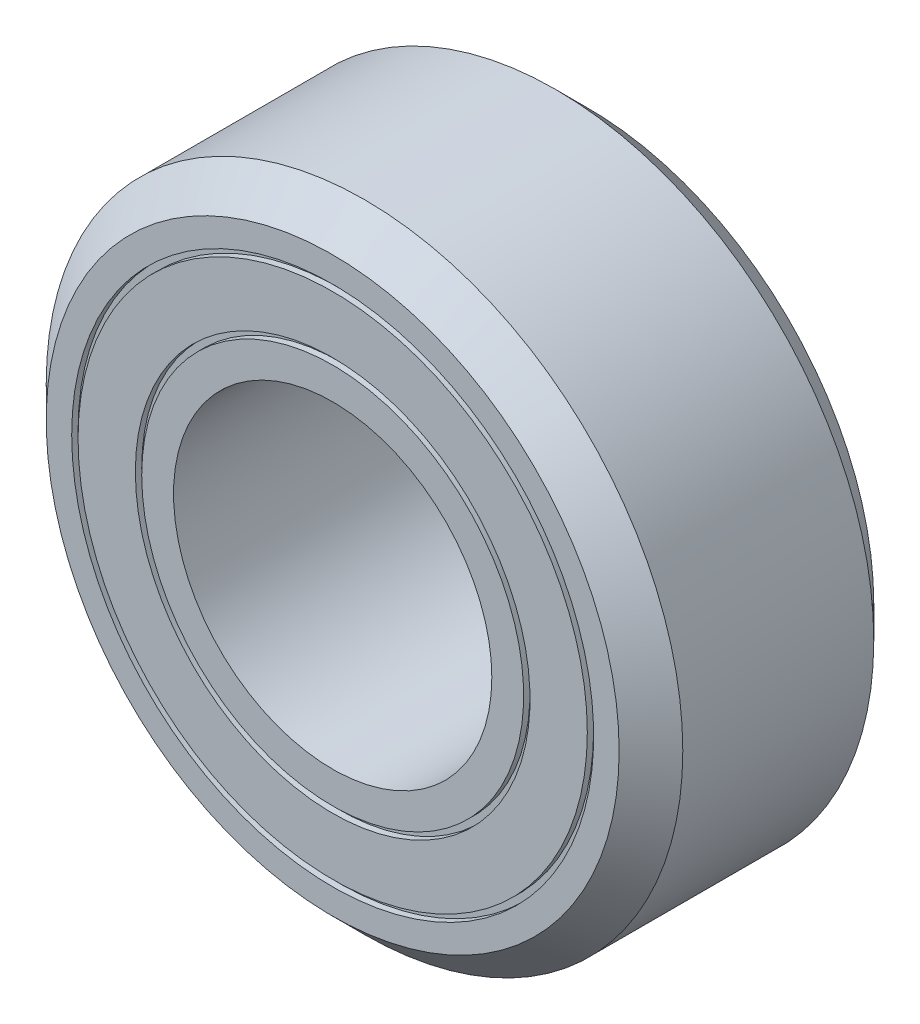
ISO-10303-21;
HEADER;
FILE_DESCRIPTION(('STEP AP214'),'2;1');
FILE_NAME('part.step','',(''),(''),'','','');
FILE_SCHEMA(('AUTOMOTIVE_DESIGN { 1 0 10303 214 1 1 1 1 }'));
ENDSEC;
DATA;
#1=APPLICATION_CONTEXT('core data for automotive mechanical design processes');
#2=APPLICATION_PROTOCOL_DEFINITION('international standard','automotive_design',2000,#1);
#3=PRODUCT_CONTEXT('',#1,'mechanical');
#4=PRODUCT('Part','Part','',(#3));
#5=PRODUCT_RELATED_PRODUCT_CATEGORY('part','',(#4));
#6=PRODUCT_DEFINITION_FORMATION('','',#4);
#7=PRODUCT_DEFINITION_CONTEXT('part definition',#1,'design');
#8=PRODUCT_DEFINITION('design','',#6,#7);
#9=PRODUCT_DEFINITION_SHAPE('','',#8);
#10=(LENGTH_UNIT() NAMED_UNIT(*) SI_UNIT(.MILLI.,.METRE.));
#11=(NAMED_UNIT(*) PLANE_ANGLE_UNIT() SI_UNIT($,.RADIAN.));
#12=(NAMED_UNIT(*) SI_UNIT($,.STERADIAN.) SOLID_ANGLE_UNIT());
#13=UNCERTAINTY_MEASURE_WITH_UNIT(LENGTH_MEASURE(1.E-05),#10,'distance_accuracy_value','');
#14=(GEOMETRIC_REPRESENTATION_CONTEXT(3) GLOBAL_UNCERTAINTY_ASSIGNED_CONTEXT((#13)) GLOBAL_UNIT_ASSIGNED_CONTEXT((#10,
#11,#12)) REPRESENTATION_CONTEXT('',''));
#15=CARTESIAN_POINT('',(0.,0.,0.));
#16=DIRECTION('',(0.,0.,1.));
#17=DIRECTION('',(1.,0.,0.));
#18=AXIS2_PLACEMENT_3D('',#15,#16,#17);
#19=CARTESIAN_POINT('',(0.,0.,4.));
#20=DIRECTION('',(0.,0.,1.));
#21=DIRECTION('',(1.,0.,0.));
#22=AXIS2_PLACEMENT_3D('',#19,#20,#21);
#23=PLANE('',#22);
#24=CARTESIAN_POINT('',(0.,0.,4.));
#25=DIRECTION('',(0.,0.,1.));
#26=DIRECTION('',(1.,0.,0.));
#27=AXIS2_PLACEMENT_3D('',#24,#25,#26);
#28=CIRCLE('',#27,2.5);
#29=CARTESIAN_POINT('',(2.5,0.,4.));
#30=VERTEX_POINT('',#29);
#31=EDGE_CURVE('E104',#30,#30,#28,.T.);
#32=ORIENTED_EDGE('',*,*,#31,.F.);
#33=EDGE_LOOP('',(#32));
#34=FACE_BOUND('',#33,.T.);
#35=CARTESIAN_POINT('',(0.,0.,4.));
#36=DIRECTION('',(0.,0.,-1.));
#37=DIRECTION('',(-1.,0.,0.));
#38=AXIS2_PLACEMENT_3D('',#35,#36,#37);
#39=CIRCLE('',#38,3.);
#40=CARTESIAN_POINT('',(-3.,0.,4.));
#41=VERTEX_POINT('',#40);
#42=EDGE_CURVE('E169',#41,#41,#39,.T.);
#43=ORIENTED_EDGE('',*,*,#42,.F.);
#44=EDGE_LOOP('',(#43));
#45=FACE_BOUND('',#44,.T.);
#46=ADVANCED_FACE('F79',(#34,#45),#23,.T.);
#47=CARTESIAN_POINT('',(0.,0.,0.));
#48=DIRECTION('',(0.,0.,1.));
#49=DIRECTION('',(1.,0.,0.));
#50=AXIS2_PLACEMENT_3D('',#47,#48,#49);
#51=PLANE('',#50);
#52=CARTESIAN_POINT('',(0.,0.,0.));
#53=DIRECTION('',(0.,0.,1.));
#54=DIRECTION('',(1.,0.,0.));
#55=AXIS2_PLACEMENT_3D('',#52,#53,#54);
#56=CIRCLE('',#55,2.5);
#57=CARTESIAN_POINT('',(2.5,0.,0.));
#58=VERTEX_POINT('',#57);
#59=EDGE_CURVE('E105',#58,#58,#56,.T.);
#60=ORIENTED_EDGE('',*,*,#59,.T.);
#61=EDGE_LOOP('',(#60));
#62=FACE_BOUND('',#61,.T.);
#63=CARTESIAN_POINT('',(0.,0.,0.));
#64=DIRECTION('',(0.,0.,-1.));
#65=DIRECTION('',(-1.,0.,0.));
#66=AXIS2_PLACEMENT_3D('',#63,#64,#65);
#67=CIRCLE('',#66,3.);
#68=CARTESIAN_POINT('',(-3.,0.,0.));
#69=VERTEX_POINT('',#68);
#70=EDGE_CURVE('E122',#69,#69,#67,.T.);
#71=ORIENTED_EDGE('',*,*,#70,.T.);
#72=EDGE_LOOP('',(#71));
#73=FACE_BOUND('',#72,.T.);
#74=ADVANCED_FACE('F187',(#62,#73),#51,.F.);
#75=CARTESIAN_POINT('',(0.,0.,4.));
#76=DIRECTION('',(0.,0.,-1.));
#77=DIRECTION('',(-1.,0.,0.));
#78=AXIS2_PLACEMENT_3D('',#75,#76,#77);
#79=CIRCLE('',#78,4.1);
#80=CARTESIAN_POINT('',(-4.1,0.,4.));
#81=VERTEX_POINT('',#80);
#82=EDGE_CURVE('E145',#81,#81,#79,.T.);
#83=ORIENTED_EDGE('',*,*,#82,.T.);
#84=EDGE_LOOP('',(#83));
#85=FACE_BOUND('',#84,.T.);
#86=CARTESIAN_POINT('',(0.,0.,4.));
#87=DIRECTION('',(0.,0.,1.));
#88=DIRECTION('',(1.,0.,0.));
#89=AXIS2_PLACEMENT_3D('',#86,#87,#88);
#90=CIRCLE('',#89,4.5);
#91=CARTESIAN_POINT('',(4.5,0.,4.));
#92=VERTEX_POINT('',#91);
#93=EDGE_CURVE('E11',#92,#92,#90,.T.);
#94=ORIENTED_EDGE('',*,*,#93,.T.);
#95=EDGE_LOOP('',(#94));
#96=FACE_BOUND('',#95,.T.);
#97=ADVANCED_FACE('F191',(#85,#96),#23,.T.);
#98=CARTESIAN_POINT('',(0.,0.,0.));
#99=DIRECTION('',(0.,0.,-1.));
#100=DIRECTION('',(-1.,0.,0.));
#101=AXIS2_PLACEMENT_3D('',#98,#99,#100);
#102=CIRCLE('',#101,4.1);
#103=CARTESIAN_POINT('',(-4.1,0.,0.));
#104=VERTEX_POINT('',#103);
#105=EDGE_CURVE('E113',#104,#104,#102,.T.);
#106=ORIENTED_EDGE('',*,*,#105,.F.);
#107=EDGE_LOOP('',(#106));
#108=FACE_BOUND('',#107,.T.);
#109=CARTESIAN_POINT('',(0.,0.,0.));
#110=DIRECTION('',(0.,0.,1.));
#111=DIRECTION('',(1.,0.,0.));
#112=AXIS2_PLACEMENT_3D('',#109,#110,#111);
#113=CIRCLE('',#112,4.49999999999999);
#114=CARTESIAN_POINT('',(4.49999999999999,0.,0.));
#115=VERTEX_POINT('',#114);
#116=EDGE_CURVE('E88',#115,#115,#113,.F.);
#117=ORIENTED_EDGE('',*,*,#116,.T.);
#118=EDGE_LOOP('',(#117));
#119=FACE_BOUND('',#118,.T.);
#120=ADVANCED_FACE('F198',(#108,#119),#51,.F.);
#121=CARTESIAN_POINT('',(0.,0.,4.));
#122=DIRECTION('',(0.,0.,-1.));
#123=DIRECTION('',(-1.,0.,0.));
#124=AXIS2_PLACEMENT_3D('',#121,#122,#123);
#125=CYLINDRICAL_SURFACE('',#124,5.);
#126=CARTESIAN_POINT('',(0.,0.,0.500000000000005));
#127=DIRECTION('',(0.,0.,1.));
#128=DIRECTION('',(1.,0.,0.));
#129=AXIS2_PLACEMENT_3D('',#126,#127,#128);
#130=CIRCLE('',#129,5.);
#131=CARTESIAN_POINT('',(5.,0.,0.500000000000005));
#132=VERTEX_POINT('',#131);
#133=EDGE_CURVE('E93',#132,#132,#130,.T.);
#134=ORIENTED_EDGE('',*,*,#133,.T.);
#135=EDGE_LOOP('',(#134));
#136=FACE_BOUND('',#135,.T.);
#137=CARTESIAN_POINT('',(0.,0.,3.5));
#138=DIRECTION('',(0.,0.,1.));
#139=DIRECTION('',(1.,0.,0.));
#140=AXIS2_PLACEMENT_3D('',#137,#138,#139);
#141=CIRCLE('',#140,5.);
#142=CARTESIAN_POINT('',(5.,0.,3.5));
#143=VERTEX_POINT('',#142);
#144=EDGE_CURVE('E98',#143,#143,#141,.F.);
#145=ORIENTED_EDGE('',*,*,#144,.T.);
#146=EDGE_LOOP('',(#145));
#147=FACE_BOUND('',#146,.T.);
#148=ADVANCED_FACE('F209',(#136,#147),#125,.T.);
#149=CARTESIAN_POINT('',(0.,0.,4.));
#150=DIRECTION('',(0.,0.,-1.));
#151=DIRECTION('',(-1.,0.,0.));
#152=AXIS2_PLACEMENT_3D('',#149,#150,#151);
#153=CYLINDRICAL_SURFACE('',#152,2.5);
#154=ORIENTED_EDGE('',*,*,#31,.T.);
#155=EDGE_LOOP('',(#154));
#156=FACE_BOUND('',#155,.T.);
#157=ORIENTED_EDGE('',*,*,#59,.F.);
#158=EDGE_LOOP('',(#157));
#159=FACE_BOUND('',#158,.T.);
#160=ADVANCED_FACE('F251',(#156,#159),#153,.F.);
#161=CARTESIAN_POINT('',(0.,0.,0.500000000000005));
#162=DIRECTION('',(0.,0.,1.));
#163=DIRECTION('',(1.,0.,0.));
#164=AXIS2_PLACEMENT_3D('',#161,#162,#163);
#165=CONICAL_SURFACE('',#164,5.,0.785398163397449);
#166=ORIENTED_EDGE('',*,*,#116,.F.);
#167=EDGE_LOOP('',(#166));
#168=FACE_BOUND('',#167,.T.);
#169=ORIENTED_EDGE('',*,*,#133,.F.);
#170=EDGE_LOOP('',(#169));
#171=FACE_BOUND('',#170,.T.);
#172=ADVANCED_FACE('F253',(#168,#171),#165,.T.);
#173=CARTESIAN_POINT('',(0.,0.,4.));
#174=DIRECTION('',(0.,0.,-1.));
#175=DIRECTION('',(-1.,0.,0.));
#176=AXIS2_PLACEMENT_3D('',#173,#174,#175);
#177=CONICAL_SURFACE('',#176,4.5,0.785398163397447);
#178=ORIENTED_EDGE('',*,*,#144,.F.);
#179=EDGE_LOOP('',(#178));
#180=FACE_BOUND('',#179,.T.);
#181=ORIENTED_EDGE('',*,*,#93,.F.);
#182=EDGE_LOOP('',(#181));
#183=FACE_BOUND('',#182,.T.);
#184=ADVANCED_FACE('F82',(#180,#183),#177,.T.);
#185=CARTESIAN_POINT('',(0.,0.,0.1));
#186=DIRECTION('',(0.,0.,-1.));
#187=DIRECTION('',(-1.,0.,0.));
#188=AXIS2_PLACEMENT_3D('',#185,#186,#187);
#189=CYLINDRICAL_SURFACE('',#188,4.);
#190=CARTESIAN_POINT('',(0.,0.,0.1));
#191=DIRECTION('',(0.,0.,-1.));
#192=DIRECTION('',(-1.,0.,0.));
#193=AXIS2_PLACEMENT_3D('',#190,#191,#192);
#194=CIRCLE('',#193,4.);
#195=CARTESIAN_POINT('',(-4.,0.,0.1));
#196=VERTEX_POINT('',#195);
#197=EDGE_CURVE('E117',#196,#196,#194,.T.);
#198=ORIENTED_EDGE('',*,*,#197,.T.);
#199=EDGE_LOOP('',(#198));
#200=FACE_BOUND('',#199,.T.);
#201=CARTESIAN_POINT('',(0.,0.,0.));
#202=DIRECTION('',(0.,0.,-1.));
#203=DIRECTION('',(-1.,0.,0.));
#204=AXIS2_PLACEMENT_3D('',#201,#202,#203);
#205=CIRCLE('',#204,4.);
#206=CARTESIAN_POINT('',(-4.,0.,0.));
#207=VERTEX_POINT('',#206);
#208=EDGE_CURVE('E118',#207,#207,#205,.T.);
#209=ORIENTED_EDGE('',*,*,#208,.F.);
#210=EDGE_LOOP('',(#209));
#211=FACE_BOUND('',#210,.T.);
#212=ADVANCED_FACE('F247',(#200,#211),#189,.T.);
#213=CARTESIAN_POINT('',(0.,0.,0.1));
#214=DIRECTION('',(0.,0.,-1.));
#215=DIRECTION('',(-1.,0.,0.));
#216=AXIS2_PLACEMENT_3D('',#213,#214,#215);
#217=CYLINDRICAL_SURFACE('',#216,4.1);
#218=CARTESIAN_POINT('',(0.,0.,0.1));
#219=DIRECTION('',(0.,0.,-1.));
#220=DIRECTION('',(-1.,0.,0.));
#221=AXIS2_PLACEMENT_3D('',#218,#219,#220);
#222=CIRCLE('',#221,4.1);
#223=CARTESIAN_POINT('',(-4.1,0.,0.1));
#224=VERTEX_POINT('',#223);
#225=EDGE_CURVE('E109',#224,#224,#222,.T.);
#226=ORIENTED_EDGE('',*,*,#225,.F.);
#227=EDGE_LOOP('',(#226));
#228=FACE_BOUND('',#227,.T.);
#229=ORIENTED_EDGE('',*,*,#105,.T.);
#230=EDGE_LOOP('',(#229));
#231=FACE_BOUND('',#230,.T.);
#232=ADVANCED_FACE('F243',(#228,#231),#217,.F.);
#233=CARTESIAN_POINT('',(0.,0.,0.1));
#234=DIRECTION('',(0.,0.,-1.));
#235=DIRECTION('',(-1.,0.,0.));
#236=AXIS2_PLACEMENT_3D('',#233,#234,#235);
#237=PLANE('',#236);
#238=ORIENTED_EDGE('',*,*,#197,.F.);
#239=EDGE_LOOP('',(#238));
#240=FACE_BOUND('',#239,.T.);
#241=ORIENTED_EDGE('',*,*,#225,.T.);
#242=EDGE_LOOP('',(#241));
#243=FACE_BOUND('',#242,.T.);
#244=ADVANCED_FACE('F240',(#240,#243),#237,.T.);
#245=CARTESIAN_POINT('',(0.,0.,0.));
#246=DIRECTION('',(0.,0.,-1.));
#247=DIRECTION('',(-1.,0.,0.));
#248=AXIS2_PLACEMENT_3D('',#245,#246,#247);
#249=CIRCLE('',#248,3.1);
#250=CARTESIAN_POINT('',(-3.1,0.,0.));
#251=VERTEX_POINT('',#250);
#252=EDGE_CURVE('E133',#251,#251,#249,.T.);
#253=ORIENTED_EDGE('',*,*,#252,.F.);
#254=EDGE_LOOP('',(#253));
#255=FACE_BOUND('',#254,.T.);
#256=ORIENTED_EDGE('',*,*,#208,.T.);
#257=EDGE_LOOP('',(#256));
#258=FACE_BOUND('',#257,.T.);
#259=ADVANCED_FACE('F197',(#255,#258),#51,.F.);
#260=CARTESIAN_POINT('',(0.,0.,0.1));
#261=DIRECTION('',(0.,0.,-1.));
#262=DIRECTION('',(-1.,0.,0.));
#263=AXIS2_PLACEMENT_3D('',#260,#261,#262);
#264=CYLINDRICAL_SURFACE('',#263,3.1);
#265=CARTESIAN_POINT('',(0.,0.,0.1));
#266=DIRECTION('',(0.,0.,-1.));
#267=DIRECTION('',(-1.,0.,0.));
#268=AXIS2_PLACEMENT_3D('',#265,#266,#267);
#269=CIRCLE('',#268,3.1);
#270=CARTESIAN_POINT('',(-3.1,0.,0.1));
#271=VERTEX_POINT('',#270);
#272=EDGE_CURVE('E137',#271,#271,#269,.T.);
#273=ORIENTED_EDGE('',*,*,#272,.F.);
#274=EDGE_LOOP('',(#273));
#275=FACE_BOUND('',#274,.T.);
#276=ORIENTED_EDGE('',*,*,#252,.T.);
#277=EDGE_LOOP('',(#276));
#278=FACE_BOUND('',#277,.T.);
#279=ADVANCED_FACE('F229',(#275,#278),#264,.F.);
#280=CARTESIAN_POINT('',(0.,0.,0.1));
#281=DIRECTION('',(0.,0.,-1.));
#282=DIRECTION('',(-1.,0.,0.));
#283=AXIS2_PLACEMENT_3D('',#280,#281,#282);
#284=PLANE('',#283);
#285=CARTESIAN_POINT('',(0.,0.,0.1));
#286=DIRECTION('',(0.,0.,-1.));
#287=DIRECTION('',(-1.,0.,0.));
#288=AXIS2_PLACEMENT_3D('',#285,#286,#287);
#289=CIRCLE('',#288,3.);
#290=CARTESIAN_POINT('',(-3.,0.,0.1));
#291=VERTEX_POINT('',#290);
#292=EDGE_CURVE('E129',#291,#291,#289,.T.);
#293=ORIENTED_EDGE('',*,*,#292,.F.);
#294=EDGE_LOOP('',(#293));
#295=FACE_BOUND('',#294,.T.);
#296=ORIENTED_EDGE('',*,*,#272,.T.);
#297=EDGE_LOOP('',(#296));
#298=FACE_BOUND('',#297,.T.);
#299=ADVANCED_FACE('F232',(#295,#298),#284,.T.);
#300=CARTESIAN_POINT('',(0.,0.,0.1));
#301=DIRECTION('',(0.,0.,-1.));
#302=DIRECTION('',(-1.,0.,0.));
#303=AXIS2_PLACEMENT_3D('',#300,#301,#302);
#304=CYLINDRICAL_SURFACE('',#303,3.);
#305=ORIENTED_EDGE('',*,*,#292,.T.);
#306=EDGE_LOOP('',(#305));
#307=FACE_BOUND('',#306,.T.);
#308=ORIENTED_EDGE('',*,*,#70,.F.);
#309=EDGE_LOOP('',(#308));
#310=FACE_BOUND('',#309,.T.);
#311=ADVANCED_FACE('F224',(#307,#310),#304,.T.);
#312=CARTESIAN_POINT('',(0.,0.,3.9));
#313=DIRECTION('',(0.,0.,1.));
#314=DIRECTION('',(1.,0.,0.));
#315=AXIS2_PLACEMENT_3D('',#312,#313,#314);
#316=CYLINDRICAL_SURFACE('',#315,4.);
#317=CARTESIAN_POINT('',(0.,0.,3.9));
#318=DIRECTION('',(0.,0.,-1.));
#319=DIRECTION('',(-1.,0.,0.));
#320=AXIS2_PLACEMENT_3D('',#317,#318,#319);
#321=CIRCLE('',#320,4.);
#322=CARTESIAN_POINT('',(-4.,0.,3.9));
#323=VERTEX_POINT('',#322);
#324=EDGE_CURVE('E149',#323,#323,#321,.T.);
#325=ORIENTED_EDGE('',*,*,#324,.F.);
#326=EDGE_LOOP('',(#325));
#327=FACE_BOUND('',#326,.T.);
#328=CARTESIAN_POINT('',(0.,0.,4.));
#329=DIRECTION('',(0.,0.,-1.));
#330=DIRECTION('',(-1.,0.,0.));
#331=AXIS2_PLACEMENT_3D('',#328,#329,#330);
#332=CIRCLE('',#331,4.);
#333=CARTESIAN_POINT('',(-4.,0.,4.));
#334=VERTEX_POINT('',#333);
#335=EDGE_CURVE('E150',#334,#334,#332,.T.);
#336=ORIENTED_EDGE('',*,*,#335,.T.);
#337=EDGE_LOOP('',(#336));
#338=FACE_BOUND('',#337,.T.);
#339=ADVANCED_FACE('F215',(#327,#338),#316,.T.);
#340=CARTESIAN_POINT('',(0.,0.,3.9));
#341=DIRECTION('',(0.,0.,1.));
#342=DIRECTION('',(1.,0.,0.));
#343=AXIS2_PLACEMENT_3D('',#340,#341,#342);
#344=CYLINDRICAL_SURFACE('',#343,4.1);
#345=CARTESIAN_POINT('',(0.,0.,3.9));
#346=DIRECTION('',(0.,0.,-1.));
#347=DIRECTION('',(-1.,0.,0.));
#348=AXIS2_PLACEMENT_3D('',#345,#346,#347);
#349=CIRCLE('',#348,4.1);
#350=CARTESIAN_POINT('',(-4.1,0.,3.9));
#351=VERTEX_POINT('',#350);
#352=EDGE_CURVE('E141',#351,#351,#349,.T.);
#353=ORIENTED_EDGE('',*,*,#352,.T.);
#354=EDGE_LOOP('',(#353));
#355=FACE_BOUND('',#354,.T.);
#356=ORIENTED_EDGE('',*,*,#82,.F.);
#357=EDGE_LOOP('',(#356));
#358=FACE_BOUND('',#357,.T.);
#359=ADVANCED_FACE('F213',(#355,#358),#344,.F.);
#360=CARTESIAN_POINT('',(0.,0.,3.9));
#361=DIRECTION('',(0.,0.,1.));
#362=DIRECTION('',(-1.,0.,0.));
#363=AXIS2_PLACEMENT_3D('',#360,#361,#362);
#364=PLANE('',#363);
#365=ORIENTED_EDGE('',*,*,#324,.T.);
#366=EDGE_LOOP('',(#365));
#367=FACE_BOUND('',#366,.T.);
#368=ORIENTED_EDGE('',*,*,#352,.F.);
#369=EDGE_LOOP('',(#368));
#370=FACE_BOUND('',#369,.T.);
#371=ADVANCED_FACE('F202',(#367,#370),#364,.T.);
#372=CARTESIAN_POINT('',(0.,0.,4.));
#373=DIRECTION('',(0.,0.,-1.));
#374=DIRECTION('',(-1.,0.,0.));
#375=AXIS2_PLACEMENT_3D('',#372,#373,#374);
#376=CIRCLE('',#375,3.1);
#377=CARTESIAN_POINT('',(-3.1,0.,4.));
#378=VERTEX_POINT('',#377);
#379=EDGE_CURVE('E161',#378,#378,#376,.T.);
#380=ORIENTED_EDGE('',*,*,#379,.T.);
#381=EDGE_LOOP('',(#380));
#382=FACE_BOUND('',#381,.T.);
#383=ORIENTED_EDGE('',*,*,#335,.F.);
#384=EDGE_LOOP('',(#383));
#385=FACE_BOUND('',#384,.T.);
#386=ADVANCED_FACE('F190',(#382,#385),#23,.T.);
#387=CARTESIAN_POINT('',(0.,0.,3.9));
#388=DIRECTION('',(0.,0.,1.));
#389=DIRECTION('',(-1.,0.,0.));
#390=AXIS2_PLACEMENT_3D('',#387,#388,#389);
#391=PLANE('',#390);
#392=CARTESIAN_POINT('',(0.,0.,3.9));
#393=DIRECTION('',(0.,0.,-1.));
#394=DIRECTION('',(-1.,0.,0.));
#395=AXIS2_PLACEMENT_3D('',#392,#393,#394);
#396=CIRCLE('',#395,3.1);
#397=CARTESIAN_POINT('',(-3.1,0.,3.9));
#398=VERTEX_POINT('',#397);
#399=EDGE_CURVE('E154',#398,#398,#396,.T.);
#400=ORIENTED_EDGE('',*,*,#399,.F.);
#401=EDGE_LOOP('',(#400));
#402=FACE_BOUND('',#401,.T.);
#403=CARTESIAN_POINT('',(0.,0.,3.9));
#404=DIRECTION('',(0.,0.,-1.));
#405=DIRECTION('',(-1.,0.,0.));
#406=AXIS2_PLACEMENT_3D('',#403,#404,#405);
#407=CIRCLE('',#406,3.);
#408=CARTESIAN_POINT('',(-3.,0.,3.9));
#409=VERTEX_POINT('',#408);
#410=EDGE_CURVE('E165',#409,#409,#407,.T.);
#411=ORIENTED_EDGE('',*,*,#410,.T.);
#412=EDGE_LOOP('',(#411));
#413=FACE_BOUND('',#412,.T.);
#414=ADVANCED_FACE('F177',(#402,#413),#391,.T.);
#415=CARTESIAN_POINT('',(0.,0.,3.9));
#416=DIRECTION('',(0.,0.,1.));
#417=DIRECTION('',(1.,0.,0.));
#418=AXIS2_PLACEMENT_3D('',#415,#416,#417);
#419=CYLINDRICAL_SURFACE('',#418,3.1);
#420=ORIENTED_EDGE('',*,*,#399,.T.);
#421=EDGE_LOOP('',(#420));
#422=FACE_BOUND('',#421,.T.);
#423=ORIENTED_EDGE('',*,*,#379,.F.);
#424=EDGE_LOOP('',(#423));
#425=FACE_BOUND('',#424,.T.);
#426=ADVANCED_FACE('F182',(#422,#425),#419,.F.);
#427=CARTESIAN_POINT('',(0.,0.,3.9));
#428=DIRECTION('',(0.,0.,1.));
#429=DIRECTION('',(1.,0.,0.));
#430=AXIS2_PLACEMENT_3D('',#427,#428,#429);
#431=CYLINDRICAL_SURFACE('',#430,3.);
#432=ORIENTED_EDGE('',*,*,#410,.F.);
#433=EDGE_LOOP('',(#432));
#434=FACE_BOUND('',#433,.T.);
#435=ORIENTED_EDGE('',*,*,#42,.T.);
#436=EDGE_LOOP('',(#435));
#437=FACE_BOUND('',#436,.T.);
#438=ADVANCED_FACE('F179',(#434,#437),#431,.T.);
#439=CLOSED_SHELL('',(#46,#74,#97,#120,#148,#160,#172,#184,#212,#232,#244,#259,#279,#299,#311,
#339,#359,#371,#386,#414,#426,#438));
#440=MANIFOLD_SOLID_BREP('B2',#439);
#441=ADVANCED_BREP_SHAPE_REPRESENTATION('',(#18,#440),#14);
#442=SHAPE_DEFINITION_REPRESENTATION(#9,#441);
ENDSEC;
END-ISO-10303-21;
